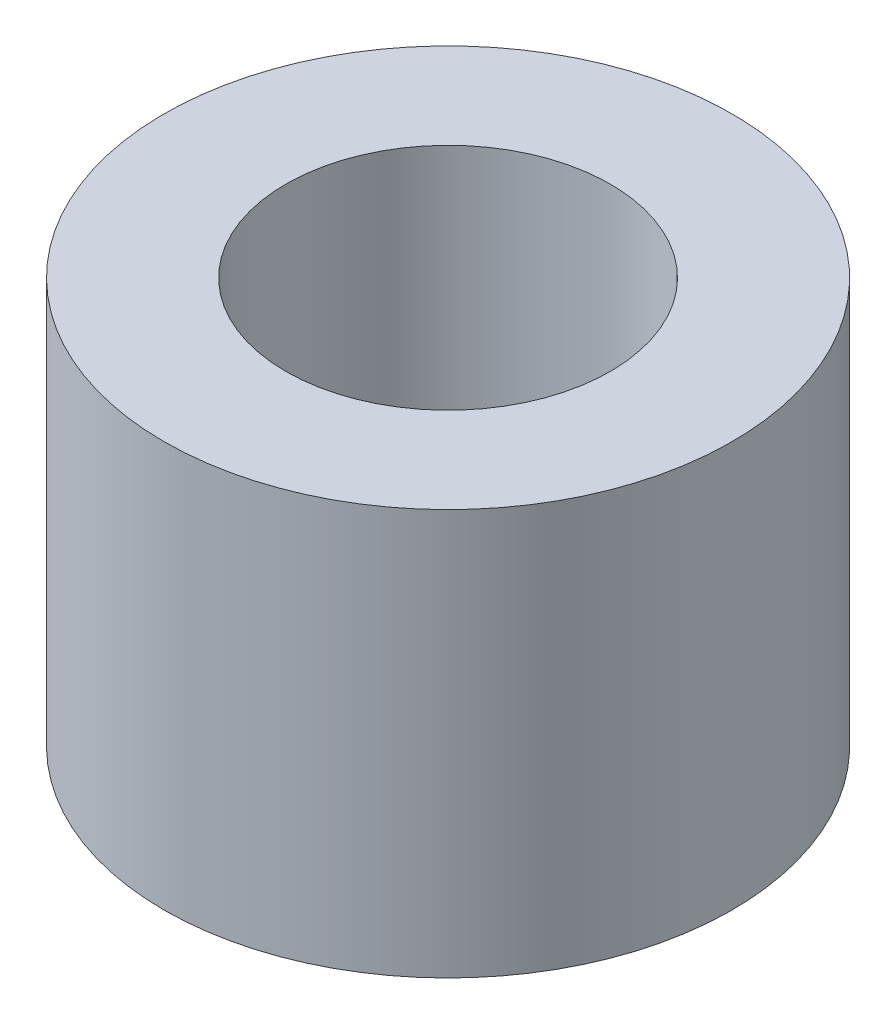
ISO-10303-21;
HEADER;
FILE_DESCRIPTION(('STEP AP214'),'2;1');
FILE_NAME('part.step','',(''),(''),'','','');
FILE_SCHEMA(('AUTOMOTIVE_DESIGN { 1 0 10303 214 1 1 1 1 }'));
ENDSEC;
DATA;
#1=APPLICATION_CONTEXT('core data for automotive mechanical design processes');
#2=APPLICATION_PROTOCOL_DEFINITION('international standard','automotive_design',2000,#1);
#3=PRODUCT_CONTEXT('',#1,'mechanical');
#4=PRODUCT('Part','Part','',(#3));
#5=PRODUCT_RELATED_PRODUCT_CATEGORY('part','',(#4));
#6=PRODUCT_DEFINITION_FORMATION('','',#4);
#7=PRODUCT_DEFINITION_CONTEXT('part definition',#1,'design');
#8=PRODUCT_DEFINITION('design','',#6,#7);
#9=PRODUCT_DEFINITION_SHAPE('','',#8);
#10=(LENGTH_UNIT() NAMED_UNIT(*) SI_UNIT(.MILLI.,.METRE.));
#11=(NAMED_UNIT(*) PLANE_ANGLE_UNIT() SI_UNIT($,.RADIAN.));
#12=(NAMED_UNIT(*) SI_UNIT($,.STERADIAN.) SOLID_ANGLE_UNIT());
#13=UNCERTAINTY_MEASURE_WITH_UNIT(LENGTH_MEASURE(1.E-05),#10,'distance_accuracy_value','');
#14=(GEOMETRIC_REPRESENTATION_CONTEXT(3) GLOBAL_UNCERTAINTY_ASSIGNED_CONTEXT((#13)) GLOBAL_UNIT_ASSIGNED_CONTEXT((#10,
#11,#12)) REPRESENTATION_CONTEXT('',''));
#15=CARTESIAN_POINT('',(0.,0.,0.));
#16=DIRECTION('',(0.,0.,1.));
#17=DIRECTION('',(1.,0.,0.));
#18=AXIS2_PLACEMENT_3D('',#15,#16,#17);
#19=CARTESIAN_POINT('',(0.,5.,0.));
#20=DIRECTION('',(0.,1.,0.));
#21=DIRECTION('',(0.,0.,1.));
#22=AXIS2_PLACEMENT_3D('',#19,#20,#21);
#23=PLANE('',#22);
#24=CARTESIAN_POINT('',(0.,5.,0.));
#25=DIRECTION('',(0.,1.,0.));
#26=DIRECTION('',(0.,0.,1.));
#27=AXIS2_PLACEMENT_3D('',#24,#25,#26);
#28=CIRCLE('',#27,3.5);
#29=CARTESIAN_POINT('',(0.,5.,3.5));
#30=VERTEX_POINT('',#29);
#31=EDGE_CURVE('E10',#30,#30,#28,.T.);
#32=ORIENTED_EDGE('',*,*,#31,.T.);
#33=EDGE_LOOP('',(#32));
#34=FACE_BOUND('',#33,.T.);
#35=CARTESIAN_POINT('',(0.,5.,0.));
#36=DIRECTION('',(0.,1.,0.));
#37=DIRECTION('',(0.,0.,1.));
#38=AXIS2_PLACEMENT_3D('',#35,#36,#37);
#39=CIRCLE('',#38,2.);
#40=CARTESIAN_POINT('',(0.,5.,2.));
#41=VERTEX_POINT('',#40);
#42=EDGE_CURVE('E50',#41,#41,#39,.T.);
#43=ORIENTED_EDGE('',*,*,#42,.F.);
#44=EDGE_LOOP('',(#43));
#45=FACE_BOUND('',#44,.T.);
#46=ADVANCED_FACE('F37',(#34,#45),#23,.T.);
#47=CARTESIAN_POINT('',(0.,0.,0.));
#48=DIRECTION('',(0.,1.,0.));
#49=DIRECTION('',(0.,0.,1.));
#50=AXIS2_PLACEMENT_3D('',#47,#48,#49);
#51=PLANE('',#50);
#52=CARTESIAN_POINT('',(0.,0.,0.));
#53=DIRECTION('',(0.,1.,0.));
#54=DIRECTION('',(0.,0.,1.));
#55=AXIS2_PLACEMENT_3D('',#52,#53,#54);
#56=CIRCLE('',#55,3.5);
#57=CARTESIAN_POINT('',(0.,0.,3.5));
#58=VERTEX_POINT('',#57);
#59=EDGE_CURVE('E41',#58,#58,#56,.T.);
#60=ORIENTED_EDGE('',*,*,#59,.F.);
#61=EDGE_LOOP('',(#60));
#62=FACE_BOUND('',#61,.T.);
#63=CARTESIAN_POINT('',(0.,0.,0.));
#64=DIRECTION('',(0.,1.,0.));
#65=DIRECTION('',(0.,0.,1.));
#66=AXIS2_PLACEMENT_3D('',#63,#64,#65);
#67=CIRCLE('',#66,2.);
#68=CARTESIAN_POINT('',(0.,0.,2.));
#69=VERTEX_POINT('',#68);
#70=EDGE_CURVE('E52',#69,#69,#67,.T.);
#71=ORIENTED_EDGE('',*,*,#70,.T.);
#72=EDGE_LOOP('',(#71));
#73=FACE_BOUND('',#72,.T.);
#74=ADVANCED_FACE('F64',(#62,#73),#51,.F.);
#75=CARTESIAN_POINT('',(0.,5.,0.));
#76=DIRECTION('',(0.,-1.,0.));
#77=DIRECTION('',(0.,0.,-1.));
#78=AXIS2_PLACEMENT_3D('',#75,#76,#77);
#79=CYLINDRICAL_SURFACE('',#78,3.5);
#80=ORIENTED_EDGE('',*,*,#31,.F.);
#81=EDGE_LOOP('',(#80));
#82=FACE_BOUND('',#81,.T.);
#83=ORIENTED_EDGE('',*,*,#59,.T.);
#84=EDGE_LOOP('',(#83));
#85=FACE_BOUND('',#84,.T.);
#86=ADVANCED_FACE('F39',(#82,#85),#79,.T.);
#87=CARTESIAN_POINT('',(0.,5.,0.));
#88=DIRECTION('',(0.,-1.,0.));
#89=DIRECTION('',(0.,0.,-1.));
#90=AXIS2_PLACEMENT_3D('',#87,#88,#89);
#91=CYLINDRICAL_SURFACE('',#90,2.);
#92=ORIENTED_EDGE('',*,*,#42,.T.);
#93=EDGE_LOOP('',(#92));
#94=FACE_BOUND('',#93,.T.);
#95=ORIENTED_EDGE('',*,*,#70,.F.);
#96=EDGE_LOOP('',(#95));
#97=FACE_BOUND('',#96,.T.);
#98=ADVANCED_FACE('F60',(#94,#97),#91,.F.);
#99=CLOSED_SHELL('',(#46,#74,#86,#98));
#100=MANIFOLD_SOLID_BREP('B2',#99);
#101=ADVANCED_BREP_SHAPE_REPRESENTATION('',(#18,#100),#14);
#102=SHAPE_DEFINITION_REPRESENTATION(#9,#101);
ENDSEC;
END-ISO-10303-21;
